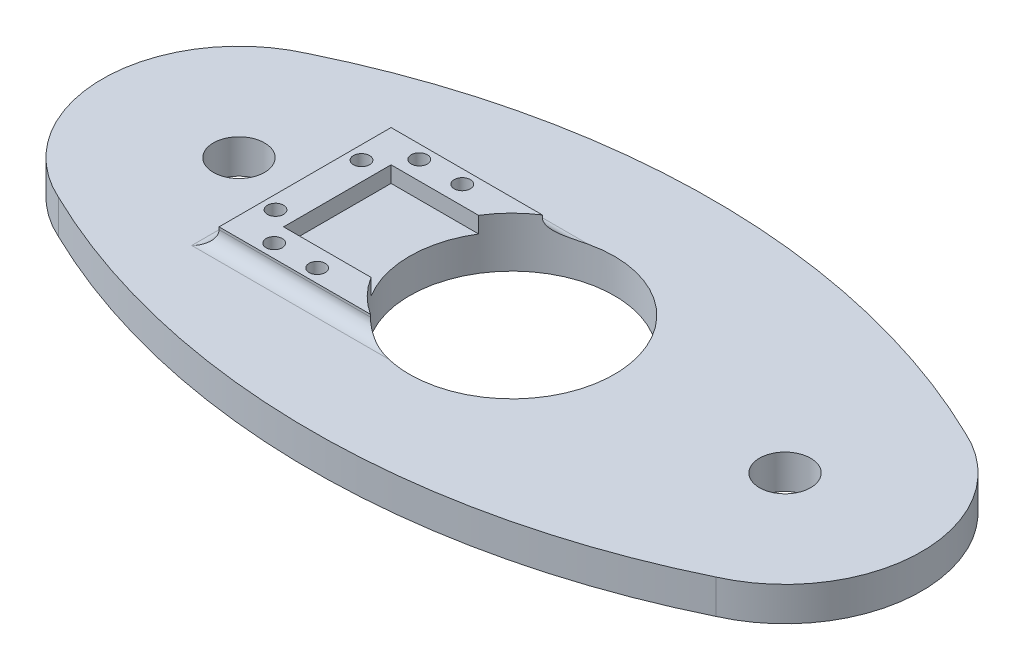
ISO-10303-21;
HEADER;
FILE_DESCRIPTION(('STEP AP214'),'2;1');
FILE_NAME('part.step','',(''),(''),'','','');
FILE_SCHEMA(('AUTOMOTIVE_DESIGN { 1 0 10303 214 1 1 1 1 }'));
ENDSEC;
DATA;
#1=APPLICATION_CONTEXT('core data for automotive mechanical design processes');
#2=APPLICATION_PROTOCOL_DEFINITION('international standard','automotive_design',2000,#1);
#3=PRODUCT_CONTEXT('',#1,'mechanical');
#4=PRODUCT('Part','Part','',(#3));
#5=PRODUCT_RELATED_PRODUCT_CATEGORY('part','',(#4));
#6=PRODUCT_DEFINITION_FORMATION('','',#4);
#7=PRODUCT_DEFINITION_CONTEXT('part definition',#1,'design');
#8=PRODUCT_DEFINITION('design','',#6,#7);
#9=PRODUCT_DEFINITION_SHAPE('','',#8);
#10=(LENGTH_UNIT() NAMED_UNIT(*) SI_UNIT(.MILLI.,.METRE.));
#11=(NAMED_UNIT(*) PLANE_ANGLE_UNIT() SI_UNIT($,.RADIAN.));
#12=(NAMED_UNIT(*) SI_UNIT($,.STERADIAN.) SOLID_ANGLE_UNIT());
#13=UNCERTAINTY_MEASURE_WITH_UNIT(LENGTH_MEASURE(1.E-05),#10,'distance_accuracy_value','');
#14=(GEOMETRIC_REPRESENTATION_CONTEXT(3) GLOBAL_UNCERTAINTY_ASSIGNED_CONTEXT((#13)) GLOBAL_UNIT_ASSIGNED_CONTEXT((#10,
#11,#12)) REPRESENTATION_CONTEXT('',''));
#15=CARTESIAN_POINT('',(0.,0.,0.));
#16=DIRECTION('',(0.,0.,1.));
#17=DIRECTION('',(1.,0.,0.));
#18=AXIS2_PLACEMENT_3D('',#15,#16,#17);
#19=CARTESIAN_POINT('',(-30.75,0.,13.5));
#20=DIRECTION('',(0.,1.,0.));
#21=DIRECTION('',(0.,0.,1.));
#22=AXIS2_PLACEMENT_3D('',#19,#20,#21);
#23=CYLINDRICAL_SURFACE('',#22,1.5);
#24=CARTESIAN_POINT('',(-30.75,9.35,13.5));
#25=DIRECTION('',(0.,1.,0.));
#26=DIRECTION('',(0.,0.,1.));
#27=AXIS2_PLACEMENT_3D('',#24,#25,#26);
#28=CIRCLE('',#27,1.5);
#29=CARTESIAN_POINT('',(-30.75,9.35,15.));
#30=VERTEX_POINT('',#29);
#31=EDGE_CURVE('E279',#30,#30,#28,.T.);
#32=ORIENTED_EDGE('',*,*,#31,.T.);
#33=EDGE_LOOP('',(#32));
#34=FACE_BOUND('',#33,.T.);
#35=CARTESIAN_POINT('',(-30.75,2.85,13.5));
#36=DIRECTION('',(0.,-1.,0.));
#37=DIRECTION('',(0.,0.,-1.));
#38=AXIS2_PLACEMENT_3D('',#35,#36,#37);
#39=CIRCLE('',#38,1.5);
#40=CARTESIAN_POINT('',(-30.75,2.85,12.));
#41=VERTEX_POINT('',#40);
#42=EDGE_CURVE('E138',#41,#41,#39,.F.);
#43=ORIENTED_EDGE('',*,*,#42,.F.);
#44=EDGE_LOOP('',(#43));
#45=FACE_BOUND('',#44,.T.);
#46=ADVANCED_FACE('F133',(#34,#45),#23,.F.);
#47=CARTESIAN_POINT('',(-22.75,0.,-13.5));
#48=DIRECTION('',(0.,1.,0.));
#49=DIRECTION('',(0.,0.,1.));
#50=AXIS2_PLACEMENT_3D('',#47,#48,#49);
#51=CYLINDRICAL_SURFACE('',#50,1.5);
#52=CARTESIAN_POINT('',(-22.75,9.35,-13.5));
#53=DIRECTION('',(0.,1.,0.));
#54=DIRECTION('',(0.,0.,1.));
#55=AXIS2_PLACEMENT_3D('',#52,#53,#54);
#56=CIRCLE('',#55,1.5);
#57=CARTESIAN_POINT('',(-22.75,9.35,-12.));
#58=VERTEX_POINT('',#57);
#59=EDGE_CURVE('E796',#58,#58,#56,.T.);
#60=ORIENTED_EDGE('',*,*,#59,.T.);
#61=EDGE_LOOP('',(#60));
#62=FACE_BOUND('',#61,.T.);
#63=CARTESIAN_POINT('',(-22.75,2.85,-13.5));
#64=DIRECTION('',(0.,-1.,0.));
#65=DIRECTION('',(0.,0.,-1.));
#66=AXIS2_PLACEMENT_3D('',#63,#64,#65);
#67=CIRCLE('',#66,1.5);
#68=CARTESIAN_POINT('',(-22.75,2.85,-15.));
#69=VERTEX_POINT('',#68);
#70=EDGE_CURVE('E833',#69,#69,#67,.F.);
#71=ORIENTED_EDGE('',*,*,#70,.F.);
#72=EDGE_LOOP('',(#71));
#73=FACE_BOUND('',#72,.T.);
#74=ADVANCED_FACE('F390',(#62,#73),#51,.F.);
#75=CARTESIAN_POINT('',(-30.75,0.,-13.5));
#76=DIRECTION('',(0.,1.,0.));
#77=DIRECTION('',(0.,0.,1.));
#78=AXIS2_PLACEMENT_3D('',#75,#76,#77);
#79=CYLINDRICAL_SURFACE('',#78,1.5);
#80=CARTESIAN_POINT('',(-30.75,9.35,-13.5));
#81=DIRECTION('',(0.,1.,0.));
#82=DIRECTION('',(0.,0.,1.));
#83=AXIS2_PLACEMENT_3D('',#80,#81,#82);
#84=CIRCLE('',#83,1.5);
#85=CARTESIAN_POINT('',(-30.75,9.35,-12.));
#86=VERTEX_POINT('',#85);
#87=EDGE_CURVE('E799',#86,#86,#84,.T.);
#88=ORIENTED_EDGE('',*,*,#87,.T.);
#89=EDGE_LOOP('',(#88));
#90=FACE_BOUND('',#89,.T.);
#91=CARTESIAN_POINT('',(-30.75,2.85,-13.5));
#92=DIRECTION('',(0.,-1.,0.));
#93=DIRECTION('',(0.,0.,-1.));
#94=AXIS2_PLACEMENT_3D('',#91,#92,#93);
#95=CIRCLE('',#94,1.5);
#96=CARTESIAN_POINT('',(-30.75,2.85,-15.));
#97=VERTEX_POINT('',#96);
#98=EDGE_CURVE('E843',#97,#97,#95,.F.);
#99=ORIENTED_EDGE('',*,*,#98,.F.);
#100=EDGE_LOOP('',(#99));
#101=FACE_BOUND('',#100,.T.);
#102=ADVANCED_FACE('F396',(#90,#101),#79,.F.);
#103=CARTESIAN_POINT('',(-36.,0.,-7.99999999999999));
#104=DIRECTION('',(0.,1.,0.));
#105=DIRECTION('',(0.,0.,1.));
#106=AXIS2_PLACEMENT_3D('',#103,#104,#105);
#107=CYLINDRICAL_SURFACE('',#106,1.5);
#108=CARTESIAN_POINT('',(-36.,9.35,-7.99999999999999));
#109=DIRECTION('',(0.,1.,0.));
#110=DIRECTION('',(0.,0.,1.));
#111=AXIS2_PLACEMENT_3D('',#108,#109,#110);
#112=CIRCLE('',#111,1.5);
#113=CARTESIAN_POINT('',(-36.,9.35,-6.49999999999999));
#114=VERTEX_POINT('',#113);
#115=EDGE_CURVE('E807',#114,#114,#112,.T.);
#116=ORIENTED_EDGE('',*,*,#115,.T.);
#117=EDGE_LOOP('',(#116));
#118=FACE_BOUND('',#117,.T.);
#119=CARTESIAN_POINT('',(-36.,2.85,-7.99999999999999));
#120=DIRECTION('',(0.,-1.,0.));
#121=DIRECTION('',(0.,0.,-1.));
#122=AXIS2_PLACEMENT_3D('',#119,#120,#121);
#123=CIRCLE('',#122,1.5);
#124=CARTESIAN_POINT('',(-36.,2.85,-9.5));
#125=VERTEX_POINT('',#124);
#126=EDGE_CURVE('E840',#125,#125,#123,.F.);
#127=ORIENTED_EDGE('',*,*,#126,.F.);
#128=EDGE_LOOP('',(#127));
#129=FACE_BOUND('',#128,.T.);
#130=ADVANCED_FACE('F603',(#118,#129),#107,.F.);
#131=CARTESIAN_POINT('',(-36.,0.,8.));
#132=DIRECTION('',(0.,1.,0.));
#133=DIRECTION('',(0.,0.,1.));
#134=AXIS2_PLACEMENT_3D('',#131,#132,#133);
#135=CYLINDRICAL_SURFACE('',#134,1.5);
#136=CARTESIAN_POINT('',(-36.,9.35,8.));
#137=DIRECTION('',(0.,1.,0.));
#138=DIRECTION('',(0.,0.,1.));
#139=AXIS2_PLACEMENT_3D('',#136,#137,#138);
#140=CIRCLE('',#139,1.5);
#141=CARTESIAN_POINT('',(-36.,9.35,9.50000000000001));
#142=VERTEX_POINT('',#141);
#143=EDGE_CURVE('E804',#142,#142,#140,.T.);
#144=ORIENTED_EDGE('',*,*,#143,.T.);
#145=EDGE_LOOP('',(#144));
#146=FACE_BOUND('',#145,.T.);
#147=CARTESIAN_POINT('',(-36.,2.85,8.));
#148=DIRECTION('',(0.,-1.,0.));
#149=DIRECTION('',(0.,0.,-1.));
#150=AXIS2_PLACEMENT_3D('',#147,#148,#149);
#151=CIRCLE('',#150,1.5);
#152=CARTESIAN_POINT('',(-36.,2.85,6.5));
#153=VERTEX_POINT('',#152);
#154=EDGE_CURVE('E837',#153,#153,#151,.F.);
#155=ORIENTED_EDGE('',*,*,#154,.F.);
#156=EDGE_LOOP('',(#155));
#157=FACE_BOUND('',#156,.T.);
#158=ADVANCED_FACE('F612',(#146,#157),#135,.F.);
#159=CARTESIAN_POINT('',(-22.75,0.,13.5));
#160=DIRECTION('',(0.,1.,0.));
#161=DIRECTION('',(0.,0.,1.));
#162=AXIS2_PLACEMENT_3D('',#159,#160,#161);
#163=CYLINDRICAL_SURFACE('',#162,1.5);
#164=CARTESIAN_POINT('',(-22.75,9.35,13.5));
#165=DIRECTION('',(0.,1.,0.));
#166=DIRECTION('',(0.,0.,1.));
#167=AXIS2_PLACEMENT_3D('',#164,#165,#166);
#168=CIRCLE('',#167,1.5);
#169=CARTESIAN_POINT('',(-22.75,9.35,15.));
#170=VERTEX_POINT('',#169);
#171=EDGE_CURVE('E801',#170,#170,#168,.T.);
#172=ORIENTED_EDGE('',*,*,#171,.T.);
#173=EDGE_LOOP('',(#172));
#174=FACE_BOUND('',#173,.T.);
#175=CARTESIAN_POINT('',(-22.75,2.85,13.5));
#176=DIRECTION('',(0.,-1.,0.));
#177=DIRECTION('',(0.,0.,-1.));
#178=AXIS2_PLACEMENT_3D('',#175,#176,#177);
#179=CIRCLE('',#178,1.5);
#180=CARTESIAN_POINT('',(-22.75,2.85,12.));
#181=VERTEX_POINT('',#180);
#182=EDGE_CURVE('E793',#181,#181,#179,.F.);
#183=ORIENTED_EDGE('',*,*,#182,.F.);
#184=EDGE_LOOP('',(#183));
#185=FACE_BOUND('',#184,.T.);
#186=ADVANCED_FACE('F450',(#174,#185),#163,.F.);
#187=CARTESIAN_POINT('',(0.,6.35,0.));
#188=DIRECTION('',(0.,1.,0.));
#189=DIRECTION('',(0.,0.,1.));
#190=AXIS2_PLACEMENT_3D('',#187,#188,#189);
#191=PLANE('',#190);
#192=DIRECTION('',(0.,0.,1.));
#193=VECTOR('',#192,1.);
#194=CARTESIAN_POINT('',(-32.5,6.35,0.));
#195=LINE('',#194,#193);
#196=CARTESIAN_POINT('',(-32.5,6.35,-10.));
#197=VERTEX_POINT('',#196);
#198=CARTESIAN_POINT('',(-32.5,6.35,10.));
#199=VERTEX_POINT('',#198);
#200=EDGE_CURVE('E247',#197,#199,#195,.T.);
#201=ORIENTED_EDGE('',*,*,#200,.T.);
#202=DIRECTION('',(1.,0.,0.));
#203=VECTOR('',#202,1.);
#204=CARTESIAN_POINT('',(0.,6.35,10.));
#205=LINE('',#204,#203);
#206=CARTESIAN_POINT('',(-16.2142684077944,6.35,10.));
#207=VERTEX_POINT('',#206);
#208=EDGE_CURVE('E265',#199,#207,#205,.T.);
#209=ORIENTED_EDGE('',*,*,#208,.T.);
#210=CARTESIAN_POINT('',(0.,6.35,0.));
#211=DIRECTION('',(0.,1.,0.));
#212=DIRECTION('',(0.,0.,1.));
#213=AXIS2_PLACEMENT_3D('',#210,#211,#212);
#214=CIRCLE('',#213,19.05);
#215=CARTESIAN_POINT('',(-16.2142684077944,6.35,-10.));
#216=VERTEX_POINT('',#215);
#217=EDGE_CURVE('E253',#216,#207,#214,.T.);
#218=ORIENTED_EDGE('',*,*,#217,.F.);
#219=DIRECTION('',(-1.,0.,0.));
#220=VECTOR('',#219,1.);
#221=CARTESIAN_POINT('',(0.,6.35,-10.));
#222=LINE('',#221,#220);
#223=EDGE_CURVE('E262',#216,#197,#222,.T.);
#224=ORIENTED_EDGE('',*,*,#223,.T.);
#225=EDGE_LOOP('',(#201,#209,#218,#224));
#226=FACE_BOUND('',#225,.T.);
#227=ADVANCED_FACE('F442',(#226),#191,.T.);
#228=DIRECTION('',(0.,0.,1.));
#229=VECTOR('',#228,1.);
#230=CARTESIAN_POINT('',(-41.04,6.35,0.));
#231=LINE('',#230,#229);
#232=CARTESIAN_POINT('',(-41.04,6.35,18.54));
#233=VERTEX_POINT('',#232);
#234=CARTESIAN_POINT('',(-41.04,6.35,-18.54));
#235=VERTEX_POINT('',#234);
#236=EDGE_CURVE('E349',#233,#235,#231,.F.);
#237=ORIENTED_EDGE('',*,*,#236,.T.);
#238=DIRECTION('',(1.,0.,0.));
#239=VECTOR('',#238,1.);
#240=CARTESIAN_POINT('',(-10.3393665183124,6.35,-18.54));
#241=LINE('',#240,#239);
#242=CARTESIAN_POINT('',(-4.3784586328981,6.35,-18.54));
#243=VERTEX_POINT('',#242);
#244=EDGE_CURVE('E351',#235,#243,#241,.T.);
#245=ORIENTED_EDGE('',*,*,#244,.T.);
#246=CARTESIAN_POINT('',(-4.37845863289817,6.35,18.54));
#247=VERTEX_POINT('',#246);
#248=EDGE_CURVE('E297',#247,#243,#214,.T.);
#249=ORIENTED_EDGE('',*,*,#248,.F.);
#250=DIRECTION('',(1.,0.,0.));
#251=VECTOR('',#250,1.);
#252=CARTESIAN_POINT('',(0.,6.35,18.54));
#253=LINE('',#252,#251);
#254=EDGE_CURVE('E346',#247,#233,#253,.F.);
#255=ORIENTED_EDGE('',*,*,#254,.T.);
#256=EDGE_LOOP('',(#237,#245,#249,#255));
#257=FACE_BOUND('',#256,.T.);
#258=CARTESIAN_POINT('',(0.,6.35,-102.409936312052));
#259=DIRECTION('',(0.,1.,0.));
#260=DIRECTION('',(0.,0.,1.));
#261=AXIS2_PLACEMENT_3D('',#258,#259,#260);
#262=CIRCLE('',#261,139.7);
#263=CARTESIAN_POINT('',(-61.1507706135107,6.35,23.1952914986314));
#264=VERTEX_POINT('',#263);
#265=CARTESIAN_POINT('',(61.1507706135112,6.35,23.1952914986312));
#266=VERTEX_POINT('',#265);
#267=EDGE_CURVE('E313',#264,#266,#262,.T.);
#268=ORIENTED_EDGE('',*,*,#267,.T.);
#269=CARTESIAN_POINT('',(50.8,6.35,0.));
#270=DIRECTION('',(0.,1.,0.));
#271=DIRECTION('',(0.,0.,1.));
#272=AXIS2_PLACEMENT_3D('',#269,#270,#271);
#273=CIRCLE('',#272,25.4);
#274=CARTESIAN_POINT('',(61.1507706135103,6.35,-23.1952914986316));
#275=VERTEX_POINT('',#274);
#276=EDGE_CURVE('E331',#266,#275,#273,.T.);
#277=ORIENTED_EDGE('',*,*,#276,.T.);
#278=CARTESIAN_POINT('',(0.,6.35,102.409936312052));
#279=DIRECTION('',(0.,1.,0.));
#280=DIRECTION('',(0.,0.,1.));
#281=AXIS2_PLACEMENT_3D('',#278,#279,#280);
#282=CIRCLE('',#281,139.7);
#283=CARTESIAN_POINT('',(-61.1507706135103,6.35,-23.1952914986316));
#284=VERTEX_POINT('',#283);
#285=EDGE_CURVE('E339',#284,#275,#282,.F.);
#286=ORIENTED_EDGE('',*,*,#285,.F.);
#287=CARTESIAN_POINT('',(-50.8,6.35,0.));
#288=DIRECTION('',(0.,1.,0.));
#289=DIRECTION('',(0.,0.,1.));
#290=AXIS2_PLACEMENT_3D('',#287,#288,#289);
#291=CIRCLE('',#290,25.4);
#292=EDGE_CURVE('E325',#284,#264,#291,.T.);
#293=ORIENTED_EDGE('',*,*,#292,.T.);
#294=EDGE_LOOP('',(#268,#277,#286,#293));
#295=FACE_BOUND('',#294,.T.);
#296=CARTESIAN_POINT('',(-50.8,6.35,0.));
#297=DIRECTION('',(0.,1.,0.));
#298=DIRECTION('',(0.,0.,1.));
#299=AXIS2_PLACEMENT_3D('',#296,#297,#298);
#300=CIRCLE('',#299,4.7625);
#301=CARTESIAN_POINT('',(-50.8,6.35,4.7625));
#302=VERTEX_POINT('',#301);
#303=EDGE_CURVE('E301',#302,#302,#300,.T.);
#304=ORIENTED_EDGE('',*,*,#303,.F.);
#305=EDGE_LOOP('',(#304));
#306=FACE_BOUND('',#305,.T.);
#307=CARTESIAN_POINT('',(50.8,6.35,0.));
#308=DIRECTION('',(0.,1.,0.));
#309=DIRECTION('',(0.,0.,1.));
#310=AXIS2_PLACEMENT_3D('',#307,#308,#309);
#311=CIRCLE('',#310,4.7625);
#312=CARTESIAN_POINT('',(50.8,6.35,4.7625));
#313=VERTEX_POINT('',#312);
#314=EDGE_CURVE('E302',#313,#313,#311,.F.);
#315=ORIENTED_EDGE('',*,*,#314,.T.);
#316=EDGE_LOOP('',(#315));
#317=FACE_BOUND('',#316,.T.);
#318=ADVANCED_FACE('F440',(#257,#295,#306,#317),#191,.T.);
#319=CARTESIAN_POINT('',(0.,0.,0.));
#320=DIRECTION('',(0.,1.,0.));
#321=DIRECTION('',(0.,0.,1.));
#322=AXIS2_PLACEMENT_3D('',#319,#320,#321);
#323=PLANE('',#322);
#324=CARTESIAN_POINT('',(-22.75,0.,-13.5));
#325=DIRECTION('',(0.,-1.,0.));
#326=DIRECTION('',(0.,0.,-1.));
#327=AXIS2_PLACEMENT_3D('',#324,#325,#326);
#328=CIRCLE('',#327,2.5);
#329=CARTESIAN_POINT('',(-22.75,0.,-16.));
#330=VERTEX_POINT('',#329);
#331=EDGE_CURVE('E787',#330,#330,#328,.T.);
#332=ORIENTED_EDGE('',*,*,#331,.F.);
#333=EDGE_LOOP('',(#332));
#334=FACE_BOUND('',#333,.T.);
#335=CARTESIAN_POINT('',(-30.75,0.,-13.5));
#336=DIRECTION('',(0.,-1.,0.));
#337=DIRECTION('',(0.,0.,-1.));
#338=AXIS2_PLACEMENT_3D('',#335,#336,#337);
#339=CIRCLE('',#338,2.5);
#340=CARTESIAN_POINT('',(-30.75,0.,-16.));
#341=VERTEX_POINT('',#340);
#342=EDGE_CURVE('E781',#341,#341,#339,.T.);
#343=ORIENTED_EDGE('',*,*,#342,.F.);
#344=EDGE_LOOP('',(#343));
#345=FACE_BOUND('',#344,.T.);
#346=CARTESIAN_POINT('',(-36.,0.,-7.99999999999999));
#347=DIRECTION('',(0.,-1.,0.));
#348=DIRECTION('',(0.,0.,-1.));
#349=AXIS2_PLACEMENT_3D('',#346,#347,#348);
#350=CIRCLE('',#349,2.5);
#351=CARTESIAN_POINT('',(-36.,0.,-10.5));
#352=VERTEX_POINT('',#351);
#353=EDGE_CURVE('E775',#352,#352,#350,.T.);
#354=ORIENTED_EDGE('',*,*,#353,.F.);
#355=EDGE_LOOP('',(#354));
#356=FACE_BOUND('',#355,.T.);
#357=CARTESIAN_POINT('',(-36.,0.,8.));
#358=DIRECTION('',(0.,-1.,0.));
#359=DIRECTION('',(0.,0.,-1.));
#360=AXIS2_PLACEMENT_3D('',#357,#358,#359);
#361=CIRCLE('',#360,2.5);
#362=CARTESIAN_POINT('',(-36.,0.,5.5));
#363=VERTEX_POINT('',#362);
#364=EDGE_CURVE('E767',#363,#363,#361,.T.);
#365=ORIENTED_EDGE('',*,*,#364,.F.);
#366=EDGE_LOOP('',(#365));
#367=FACE_BOUND('',#366,.T.);
#368=CARTESIAN_POINT('',(-30.75,0.,13.5));
#369=DIRECTION('',(0.,-1.,0.));
#370=DIRECTION('',(0.,0.,-1.));
#371=AXIS2_PLACEMENT_3D('',#368,#369,#370);
#372=CIRCLE('',#371,2.5);
#373=CARTESIAN_POINT('',(-30.75,0.,11.));
#374=VERTEX_POINT('',#373);
#375=EDGE_CURVE('E760',#374,#374,#372,.T.);
#376=ORIENTED_EDGE('',*,*,#375,.F.);
#377=EDGE_LOOP('',(#376));
#378=FACE_BOUND('',#377,.T.);
#379=CARTESIAN_POINT('',(-22.75,0.,13.5));
#380=DIRECTION('',(0.,-1.,0.));
#381=DIRECTION('',(0.,0.,-1.));
#382=AXIS2_PLACEMENT_3D('',#379,#380,#381);
#383=CIRCLE('',#382,2.5);
#384=CARTESIAN_POINT('',(-22.75,0.,11.));
#385=VERTEX_POINT('',#384);
#386=EDGE_CURVE('E764',#385,#385,#383,.T.);
#387=ORIENTED_EDGE('',*,*,#386,.F.);
#388=EDGE_LOOP('',(#387));
#389=FACE_BOUND('',#388,.T.);
#390=CARTESIAN_POINT('',(0.,0.,0.));
#391=DIRECTION('',(0.,1.,0.));
#392=DIRECTION('',(0.,0.,1.));
#393=AXIS2_PLACEMENT_3D('',#390,#391,#392);
#394=CIRCLE('',#393,19.05);
#395=CARTESIAN_POINT('',(0.,0.,19.05));
#396=VERTEX_POINT('',#395);
#397=EDGE_CURVE('E305',#396,#396,#394,.T.);
#398=ORIENTED_EDGE('',*,*,#397,.T.);
#399=EDGE_LOOP('',(#398));
#400=FACE_BOUND('',#399,.T.);
#401=CARTESIAN_POINT('',(-50.8,0.,0.));
#402=DIRECTION('',(0.,1.,0.));
#403=DIRECTION('',(0.,0.,1.));
#404=AXIS2_PLACEMENT_3D('',#401,#402,#403);
#405=CIRCLE('',#404,4.7625);
#406=CARTESIAN_POINT('',(-50.8,0.,4.7625));
#407=VERTEX_POINT('',#406);
#408=EDGE_CURVE('E310',#407,#407,#405,.T.);
#409=ORIENTED_EDGE('',*,*,#408,.T.);
#410=EDGE_LOOP('',(#409));
#411=FACE_BOUND('',#410,.T.);
#412=CARTESIAN_POINT('',(50.8,0.,0.));
#413=DIRECTION('',(0.,1.,0.));
#414=DIRECTION('',(0.,0.,1.));
#415=AXIS2_PLACEMENT_3D('',#412,#413,#414);
#416=CIRCLE('',#415,25.4);
#417=CARTESIAN_POINT('',(61.1507706135112,0.,23.1952914986312));
#418=VERTEX_POINT('',#417);
#419=CARTESIAN_POINT('',(61.1507706135103,0.,-23.1952914986316));
#420=VERTEX_POINT('',#419);
#421=EDGE_CURVE('E334',#418,#420,#416,.T.);
#422=ORIENTED_EDGE('',*,*,#421,.F.);
#423=CARTESIAN_POINT('',(0.,0.,-102.409936312052));
#424=DIRECTION('',(0.,1.,0.));
#425=DIRECTION('',(0.,0.,1.));
#426=AXIS2_PLACEMENT_3D('',#423,#424,#425);
#427=CIRCLE('',#426,139.7);
#428=CARTESIAN_POINT('',(-61.1507706135107,0.,23.1952914986314));
#429=VERTEX_POINT('',#428);
#430=EDGE_CURVE('E316',#429,#418,#427,.T.);
#431=ORIENTED_EDGE('',*,*,#430,.F.);
#432=CARTESIAN_POINT('',(-50.8,0.,0.));
#433=DIRECTION('',(0.,1.,0.));
#434=DIRECTION('',(0.,0.,1.));
#435=AXIS2_PLACEMENT_3D('',#432,#433,#434);
#436=CIRCLE('',#435,25.4);
#437=CARTESIAN_POINT('',(-61.1507706135103,0.,-23.1952914986316));
#438=VERTEX_POINT('',#437);
#439=EDGE_CURVE('E328',#438,#429,#436,.T.);
#440=ORIENTED_EDGE('',*,*,#439,.F.);
#441=CARTESIAN_POINT('',(0.,0.,102.409936312052));
#442=DIRECTION('',(0.,1.,0.));
#443=DIRECTION('',(0.,0.,1.));
#444=AXIS2_PLACEMENT_3D('',#441,#442,#443);
#445=CIRCLE('',#444,139.7);
#446=EDGE_CURVE('E330',#438,#420,#445,.F.);
#447=ORIENTED_EDGE('',*,*,#446,.T.);
#448=EDGE_LOOP('',(#422,#431,#440,#447));
#449=FACE_BOUND('',#448,.T.);
#450=CARTESIAN_POINT('',(50.8,0.,0.));
#451=DIRECTION('',(0.,1.,0.));
#452=DIRECTION('',(0.,0.,1.));
#453=AXIS2_PLACEMENT_3D('',#450,#451,#452);
#454=CIRCLE('',#453,4.7625);
#455=CARTESIAN_POINT('',(50.8,0.,4.7625));
#456=VERTEX_POINT('',#455);
#457=EDGE_CURVE('E298',#456,#456,#454,.F.);
#458=ORIENTED_EDGE('',*,*,#457,.F.);
#459=EDGE_LOOP('',(#458));
#460=FACE_BOUND('',#459,.T.);
#461=ADVANCED_FACE('F379',(#334,#345,#356,#367,#378,#389,#400,#411,#449,#460),#323,.F.);
#462=CARTESIAN_POINT('',(-50.8,0.,0.));
#463=DIRECTION('',(0.,1.,0.));
#464=DIRECTION('',(0.,0.,1.));
#465=AXIS2_PLACEMENT_3D('',#462,#463,#464);
#466=CYLINDRICAL_SURFACE('',#465,25.4);
#467=ORIENTED_EDGE('',*,*,#292,.F.);
#468=DIRECTION('',(0.,1.,0.));
#469=VECTOR('',#468,1.);
#470=CARTESIAN_POINT('',(-61.1507706135103,0.,-23.1952914986316));
#471=LINE('',#470,#469);
#472=EDGE_CURVE('E337',#438,#284,#471,.T.);
#473=ORIENTED_EDGE('',*,*,#472,.F.);
#474=ORIENTED_EDGE('',*,*,#439,.T.);
#475=DIRECTION('',(0.,1.,0.));
#476=VECTOR('',#475,1.);
#477=CARTESIAN_POINT('',(-61.1507706135107,0.,23.1952914986314));
#478=LINE('',#477,#476);
#479=EDGE_CURVE('E319',#429,#264,#478,.T.);
#480=ORIENTED_EDGE('',*,*,#479,.T.);
#481=EDGE_LOOP('',(#467,#473,#474,#480));
#482=FACE_BOUND('',#481,.T.);
#483=ADVANCED_FACE('F448',(#482),#466,.T.);
#484=CARTESIAN_POINT('',(50.8,0.,0.));
#485=DIRECTION('',(0.,1.,0.));
#486=DIRECTION('',(0.,0.,1.));
#487=AXIS2_PLACEMENT_3D('',#484,#485,#486);
#488=CYLINDRICAL_SURFACE('',#487,25.4);
#489=ORIENTED_EDGE('',*,*,#276,.F.);
#490=DIRECTION('',(0.,1.,0.));
#491=VECTOR('',#490,1.);
#492=CARTESIAN_POINT('',(61.1507706135112,0.,23.1952914986312));
#493=LINE('',#492,#491);
#494=EDGE_CURVE('E322',#418,#266,#493,.T.);
#495=ORIENTED_EDGE('',*,*,#494,.F.);
#496=ORIENTED_EDGE('',*,*,#421,.T.);
#497=DIRECTION('',(0.,1.,0.));
#498=VECTOR('',#497,1.);
#499=CARTESIAN_POINT('',(61.1507706135103,0.,-23.1952914986316));
#500=LINE('',#499,#498);
#501=EDGE_CURVE('E344',#420,#275,#500,.T.);
#502=ORIENTED_EDGE('',*,*,#501,.T.);
#503=EDGE_LOOP('',(#489,#495,#496,#502));
#504=FACE_BOUND('',#503,.T.);
#505=ADVANCED_FACE('F456',(#504),#488,.T.);
#506=CARTESIAN_POINT('',(0.,0.,102.409936312052));
#507=DIRECTION('',(0.,1.,0.));
#508=DIRECTION('',(0.,0.,1.));
#509=AXIS2_PLACEMENT_3D('',#506,#507,#508);
#510=CYLINDRICAL_SURFACE('',#509,139.7);
#511=ORIENTED_EDGE('',*,*,#285,.T.);
#512=ORIENTED_EDGE('',*,*,#501,.F.);
#513=ORIENTED_EDGE('',*,*,#446,.F.);
#514=ORIENTED_EDGE('',*,*,#472,.T.);
#515=EDGE_LOOP('',(#511,#512,#513,#514));
#516=FACE_BOUND('',#515,.T.);
#517=ADVANCED_FACE('F458',(#516),#510,.T.);
#518=CARTESIAN_POINT('',(0.,0.,-102.409936312052));
#519=DIRECTION('',(0.,1.,0.));
#520=DIRECTION('',(0.,0.,1.));
#521=AXIS2_PLACEMENT_3D('',#518,#519,#520);
#522=CYLINDRICAL_SURFACE('',#521,139.7);
#523=ORIENTED_EDGE('',*,*,#267,.F.);
#524=ORIENTED_EDGE('',*,*,#479,.F.);
#525=ORIENTED_EDGE('',*,*,#430,.T.);
#526=ORIENTED_EDGE('',*,*,#494,.T.);
#527=EDGE_LOOP('',(#523,#524,#525,#526));
#528=FACE_BOUND('',#527,.T.);
#529=ADVANCED_FACE('F434',(#528),#522,.T.);
#530=CARTESIAN_POINT('',(-50.8,0.,0.));
#531=DIRECTION('',(0.,1.,0.));
#532=DIRECTION('',(0.,0.,1.));
#533=AXIS2_PLACEMENT_3D('',#530,#531,#532);
#534=CYLINDRICAL_SURFACE('',#533,4.7625);
#535=ORIENTED_EDGE('',*,*,#408,.F.);
#536=EDGE_LOOP('',(#535));
#537=FACE_BOUND('',#536,.T.);
#538=ORIENTED_EDGE('',*,*,#303,.T.);
#539=EDGE_LOOP('',(#538));
#540=FACE_BOUND('',#539,.T.);
#541=ADVANCED_FACE('F427',(#537,#540),#534,.F.);
#542=CARTESIAN_POINT('',(50.8,0.,0.));
#543=DIRECTION('',(0.,1.,0.));
#544=DIRECTION('',(0.,0.,1.));
#545=AXIS2_PLACEMENT_3D('',#542,#543,#544);
#546=CYLINDRICAL_SURFACE('',#545,4.7625);
#547=ORIENTED_EDGE('',*,*,#457,.T.);
#548=EDGE_LOOP('',(#547));
#549=FACE_BOUND('',#548,.T.);
#550=ORIENTED_EDGE('',*,*,#314,.F.);
#551=EDGE_LOOP('',(#550));
#552=FACE_BOUND('',#551,.T.);
#553=ADVANCED_FACE('F425',(#549,#552),#546,.F.);
#554=CARTESIAN_POINT('',(0.,0.,0.));
#555=DIRECTION('',(0.,1.,0.));
#556=DIRECTION('',(0.,0.,1.));
#557=AXIS2_PLACEMENT_3D('',#554,#555,#556);
#558=CYLINDRICAL_SURFACE('',#557,19.05);
#559=ORIENTED_EDGE('',*,*,#397,.F.);
#560=EDGE_LOOP('',(#559));
#561=FACE_BOUND('',#560,.T.);
#562=DIRECTION('',(0.,-1.,0.));
#563=VECTOR('',#562,1.);
#564=CARTESIAN_POINT('',(-10.3393665183124,51.9765325600141,16.));
#565=LINE('',#564,#563);
#566=CARTESIAN_POINT('',(-10.3393665183124,9.35,16.));
#567=VERTEX_POINT('',#566);
#568=CARTESIAN_POINT('',(-10.3393665183124,8.89,16.));
#569=VERTEX_POINT('',#568);
#570=EDGE_CURVE('E257',#567,#569,#565,.T.);
#571=ORIENTED_EDGE('',*,*,#570,.T.);
#572=CARTESIAN_POINT('',(-10.3393665183124,8.89,16.));
#573=CARTESIAN_POINT('',(-10.3393871453874,8.84141264323827,15.9999842031526));
#574=CARTESIAN_POINT('',(-10.3372099674365,8.79284075558111,16.0013935449986));
#575=CARTESIAN_POINT('',(-10.328620749069,8.69629276025455,16.0069403826135));
#576=CARTESIAN_POINT('',(-10.3222143221336,8.64831594861963,16.0110742620924));
#577=CARTESIAN_POINT('',(-10.3054336593053,8.553993458912,16.0218796906637));
#578=CARTESIAN_POINT('',(-10.29511077074,8.50763481134392,16.0285183939511));
#579=CARTESIAN_POINT('',(-10.2707641508392,8.41630909376887,16.0441302139092));
#580=CARTESIAN_POINT('',(-10.2567394852268,8.3713423782717,16.0531039198937));
#581=CARTESIAN_POINT('',(-10.2097330779907,8.23947453212815,16.0830725196289));
#582=CARTESIAN_POINT('',(-10.1717105373866,8.15502921600714,16.1071855662611));
#583=CARTESIAN_POINT('',(-10.0847929610612,7.99400819244444,16.1617478846701));
#584=CARTESIAN_POINT('',(-10.0358609163765,7.91746060156446,16.1922187011678));
#585=CARTESIAN_POINT('',(-9.90170442885738,7.73459463131062,16.2747568039531));
#586=CARTESIAN_POINT('',(-9.81090490845876,7.63371660121513,16.3297695523029));
#587=CARTESIAN_POINT('',(-9.6161659695762,7.44940540931273,16.445204397167));
#588=CARTESIAN_POINT('',(-9.51219992494278,7.3660085326635,16.5056373804572));
#589=CARTESIAN_POINT('',(-9.30981712117991,7.22437313757453,16.6205145654518));
#590=CARTESIAN_POINT('',(-9.21252447456925,7.16426076003962,16.6746757163849));
#591=CARTESIAN_POINT('',(-9.01281218835231,7.05364336231739,16.7834638544345));
#592=CARTESIAN_POINT('',(-8.91038866199368,7.00314576891218,16.8380911678756));
#593=CARTESIAN_POINT('',(-8.7014984680603,6.9103464002824,16.946985889762));
#594=CARTESIAN_POINT('',(-8.59502520305645,6.868058749398,17.0012525255268));
#595=CARTESIAN_POINT('',(-8.37899053843884,6.7905870987535,17.1087575831628));
#596=CARTESIAN_POINT('',(-8.26942795145867,6.75540587392212,17.1619955960657));
#597=CARTESIAN_POINT('',(-8.04502731880388,6.69034409390022,17.2683479830801));
#598=CARTESIAN_POINT('',(-7.93012599108187,6.66062156138513,17.3214245947833));
#599=CARTESIAN_POINT('',(-7.69820118760472,6.60669906929094,17.4257391686629));
#600=CARTESIAN_POINT('',(-7.58117725652923,6.58250031011032,17.4769767291511));
#601=CARTESIAN_POINT('',(-7.22729180606578,6.51696555022443,17.6276615568006));
#602=CARTESIAN_POINT('',(-6.9877777551489,6.48273515304379,17.7240044221823));
#603=CARTESIAN_POINT('',(-6.50343473631719,6.42818083570297,17.9074028736554));
#604=CARTESIAN_POINT('',(-6.25859917179001,6.40787532650821,17.9944460362336));
#605=CARTESIAN_POINT('',(-5.76514549761295,6.37741997885387,18.1585561095474));
#606=CARTESIAN_POINT('',(-5.51652936236471,6.36726501248949,18.2356280404525));
#607=CARTESIAN_POINT('',(-5.11912329279261,6.35676445695652,18.3499474466162));
#608=CARTESIAN_POINT('',(-4.97133505855229,6.35410212978933,18.3905360996557));
#609=CARTESIAN_POINT('',(-4.67532323078072,6.35072736766284,18.4680040796742));
#610=CARTESIAN_POINT('',(-4.52710301021974,6.35000808984283,18.5048959822469));
#611=CARTESIAN_POINT('',(-4.37845863289817,6.35,18.54));
#612=B_SPLINE_CURVE_WITH_KNOTS('',3,(#572,#573,#574,#575,#576,#577,#578,#579,#580,#581,#582,
#583,#584,#585,#586,#587,#588,#589,#590,#591,#592,#593,#594,#595,#596,#597,#598,#599,#600,#601,
#602,#603,#604,#605,#606,#607,#608,#609,#610,#611),.UNSPECIFIED.,.F.,.F.,(4,2,2,2,2,2,2,2,2,2,2,
2,2,2,2,2,2,2,2,4),(0.,0.145668006133393,0.291143054847159,0.434773287304365,0.578439804748061,
0.864027487840434,1.15059914082151,1.58745985196408,2.02521855508071,2.40429989007112,
2.7836728627378,3.16369283281464,3.54386090805923,3.93372214439536,4.32366802291558,
5.10410911533344,5.88558009852865,6.66665609425827,7.12645763287319,7.58463775872894),.UNSPECIFIED.);
#613=EDGE_CURVE('E12',#569,#247,#612,.T.);
#614=ORIENTED_EDGE('',*,*,#613,.T.);
#615=ORIENTED_EDGE('',*,*,#248,.T.);
#616=CARTESIAN_POINT('',(-4.3784586328981,6.35,-18.54));
#617=CARTESIAN_POINT('',(-4.51792632811211,6.35000733337387,-18.5070634682694));
#618=CARTESIAN_POINT('',(-4.65702553305135,6.35064095058742,-18.4725513048527));
#619=CARTESIAN_POINT('',(-4.93441322653842,6.3535803388061,-18.400396807826));
#620=CARTESIAN_POINT('',(-5.07270159120438,6.35588635894217,-18.3627540085979));
#621=CARTESIAN_POINT('',(-5.34879812391607,6.3626012308786,-18.284242374114));
#622=CARTESIAN_POINT('',(-5.48660329123363,6.36701686131761,-18.243363496413));
#623=CARTESIAN_POINT('',(-5.76113985777414,6.37844448381238,-18.1585358228876));
#624=CARTESIAN_POINT('',(-5.89787130982248,6.38545634730919,-18.1145871791576));
#625=CARTESIAN_POINT('',(-6.30648956512509,6.41118459141698,-17.9781285609309));
#626=CARTESIAN_POINT('',(-6.57663479902076,6.4345908442483,-17.881052967412));
#627=CARTESIAN_POINT('',(-6.97675801631933,6.48301958581797,-17.7270353035775));
#628=CARTESIAN_POINT('',(-7.1092035826755,6.50136705431061,-17.6743302926537));
#629=CARTESIAN_POINT('',(-7.37215711674629,6.54333744266353,-17.5662740197199));
#630=CARTESIAN_POINT('',(-7.50266547200736,6.56695929177127,-17.5109232966061));
#631=CARTESIAN_POINT('',(-7.71899014445659,6.61167972160541,-17.416334469531));
#632=CARTESIAN_POINT('',(-7.80544737932613,6.63107175227075,-17.3777551508912));
#633=CARTESIAN_POINT('',(-7.97713801999214,6.67301832487901,-17.2996149644235));
#634=CARTESIAN_POINT('',(-8.0623713820865,6.69557297944502,-17.2600540616821));
#635=CARTESIAN_POINT('',(-8.31649145737875,6.76868803245692,-17.1398238273725));
#636=CARTESIAN_POINT('',(-8.48330372964307,6.82460192508815,-17.0578235399012));
#637=CARTESIAN_POINT('',(-8.74725950834457,6.92979341235681,-16.9233831147595));
#638=CARTESIAN_POINT('',(-8.84688351549221,6.97357802895907,-16.8714969660388));
#639=CARTESIAN_POINT('',(-9.0422465513976,7.06922986858326,-16.7676026864511));
#640=CARTESIAN_POINT('',(-9.137983515719,7.12110131759502,-16.7155945058892));
#641=CARTESIAN_POINT('',(-9.32382340603108,7.23388645686024,-16.6126470542228));
#642=CARTESIAN_POINT('',(-9.41395275736138,7.29475230839488,-16.5617036634516));
#643=CARTESIAN_POINT('',(-9.58728753079244,7.42704598588281,-16.4619676588913));
#644=CARTESIAN_POINT('',(-9.67050325171796,7.49845764498848,-16.4131718988173));
#645=CARTESIAN_POINT('',(-9.8151045452265,7.64093156886167,-16.3270372608418));
#646=CARTESIAN_POINT('',(-9.87785575069045,7.71023642149641,-16.2891117298702));
#647=CARTESIAN_POINT('',(-9.99475122115165,7.85800354862994,-16.2176489844671));
#648=CARTESIAN_POINT('',(-10.0488911413551,7.93647041138526,-16.1841139867634));
#649=CARTESIAN_POINT('',(-10.1463985111662,8.10354818100686,-16.1231650150727));
#650=CARTESIAN_POINT('',(-10.1896296212531,8.19226901976066,-16.0958289057394));
#651=CARTESIAN_POINT('',(-10.2610509023553,8.37767024312616,-16.0503942920811));
#652=CARTESIAN_POINT('',(-10.2892923667193,8.47432215975275,-16.0322642945361));
#653=CARTESIAN_POINT('',(-10.3187585683206,8.62515130275655,-16.0133026887491));
#654=CARTESIAN_POINT('',(-10.3264445019485,8.67761566503965,-16.0083448522033));
#655=CARTESIAN_POINT('',(-10.3367641202,8.78336893314595,-16.0016818476398));
#656=CARTESIAN_POINT('',(-10.3393855102146,8.83665952970715,-15.9999845950222));
#657=CARTESIAN_POINT('',(-10.3393665183124,8.89,-16.));
#658=B_SPLINE_CURVE_WITH_KNOTS('',3,(#616,#617,#618,#619,#620,#621,#622,#623,#624,#625,#626,
#627,#628,#629,#630,#631,#632,#633,#634,#635,#636,#637,#638,#639,#640,#641,#642,#643,#644,#645,
#646,#647,#648,#649,#650,#651,#652,#653,#654,#655,#656,#657),.UNSPECIFIED.,.F.,.F.,(4,2,2,2,2,2,
2,2,2,2,2,2,2,2,2,2,2,2,2,2,4),(0.,0.429906301335572,0.859876657191173,1.2912379900551,
1.72257796584068,2.58577335541162,3.0168422041925,3.4478236210799,3.73768094212869,
4.02754858780652,4.60892563876822,4.97034163096969,5.33194712775282,5.69169430551463,
6.05089560411904,6.35286181286418,6.65497989759037,6.96070521815613,7.26537751444552,
7.42483038949083,7.58466986592067),.UNSPECIFIED.);
#659=CARTESIAN_POINT('',(-10.3393665183124,8.89,-16.));
#660=VERTEX_POINT('',#659);
#661=EDGE_CURVE('E143',#243,#660,#658,.T.);
#662=ORIENTED_EDGE('',*,*,#661,.T.);
#663=DIRECTION('',(0.,-1.,0.));
#664=VECTOR('',#663,1.);
#665=CARTESIAN_POINT('',(-10.3393665183124,51.9765325600141,-16.));
#666=LINE('',#665,#664);
#667=CARTESIAN_POINT('',(-10.3393665183124,9.35,-16.));
#668=VERTEX_POINT('',#667);
#669=EDGE_CURVE('E283',#668,#660,#666,.T.);
#670=ORIENTED_EDGE('',*,*,#669,.F.);
#671=CARTESIAN_POINT('',(0.,9.35,0.));
#672=DIRECTION('',(0.,1.,0.));
#673=DIRECTION('',(0.,0.,1.));
#674=AXIS2_PLACEMENT_3D('',#671,#672,#673);
#675=CIRCLE('',#674,19.05);
#676=CARTESIAN_POINT('',(-16.2142684077944,9.35,-10.));
#677=VERTEX_POINT('',#676);
#678=EDGE_CURVE('E276',#677,#668,#675,.F.);
#679=ORIENTED_EDGE('',*,*,#678,.F.);
#680=DIRECTION('',(0.,-1.,0.));
#681=VECTOR('',#680,1.);
#682=CARTESIAN_POINT('',(-16.2142684077944,51.9765325600141,-10.));
#683=LINE('',#682,#681);
#684=EDGE_CURVE('E275',#677,#216,#683,.T.);
#685=ORIENTED_EDGE('',*,*,#684,.T.);
#686=ORIENTED_EDGE('',*,*,#217,.T.);
#687=DIRECTION('',(0.,-1.,0.));
#688=VECTOR('',#687,1.);
#689=CARTESIAN_POINT('',(-16.2142684077944,51.9765325600141,10.));
#690=LINE('',#689,#688);
#691=CARTESIAN_POINT('',(-16.2142684077944,9.35,10.));
#692=VERTEX_POINT('',#691);
#693=EDGE_CURVE('E250',#692,#207,#690,.T.);
#694=ORIENTED_EDGE('',*,*,#693,.F.);
#695=CARTESIAN_POINT('',(0.,9.35,0.));
#696=DIRECTION('',(0.,1.,0.));
#697=DIRECTION('',(0.,0.,1.));
#698=AXIS2_PLACEMENT_3D('',#695,#696,#697);
#699=CIRCLE('',#698,19.05);
#700=EDGE_CURVE('E238',#567,#692,#699,.F.);
#701=ORIENTED_EDGE('',*,*,#700,.F.);
#702=EDGE_LOOP('',(#571,#614,#615,#662,#670,#679,#685,#686,#694,#701));
#703=FACE_BOUND('',#702,.T.);
#704=ADVANCED_FACE('F251',(#561,#703),#558,.F.);
#705=CARTESIAN_POINT('',(0.,9.35,0.));
#706=DIRECTION('',(0.,1.,0.));
#707=DIRECTION('',(1.,0.,0.));
#708=AXIS2_PLACEMENT_3D('',#705,#706,#707);
#709=PLANE('',#708);
#710=ORIENTED_EDGE('',*,*,#171,.F.);
#711=EDGE_LOOP('',(#710));
#712=FACE_BOUND('',#711,.T.);
#713=ORIENTED_EDGE('',*,*,#143,.F.);
#714=EDGE_LOOP('',(#713));
#715=FACE_BOUND('',#714,.T.);
#716=ORIENTED_EDGE('',*,*,#115,.F.);
#717=EDGE_LOOP('',(#716));
#718=FACE_BOUND('',#717,.T.);
#719=ORIENTED_EDGE('',*,*,#87,.F.);
#720=EDGE_LOOP('',(#719));
#721=FACE_BOUND('',#720,.T.);
#722=ORIENTED_EDGE('',*,*,#59,.F.);
#723=EDGE_LOOP('',(#722));
#724=FACE_BOUND('',#723,.T.);
#725=ORIENTED_EDGE('',*,*,#31,.F.);
#726=EDGE_LOOP('',(#725));
#727=FACE_BOUND('',#726,.T.);
#728=DIRECTION('',(0.,0.,1.));
#729=VECTOR('',#728,1.);
#730=CARTESIAN_POINT('',(-32.5,9.35,0.));
#731=LINE('',#730,#729);
#732=CARTESIAN_POINT('',(-32.5,9.35,-10.));
#733=VERTEX_POINT('',#732);
#734=CARTESIAN_POINT('',(-32.5,9.35,10.));
#735=VERTEX_POINT('',#734);
#736=EDGE_CURVE('E269',#733,#735,#731,.T.);
#737=ORIENTED_EDGE('',*,*,#736,.F.);
#738=DIRECTION('',(-1.,0.,0.));
#739=VECTOR('',#738,1.);
#740=CARTESIAN_POINT('',(0.,9.35,-10.));
#741=LINE('',#740,#739);
#742=EDGE_CURVE('E272',#677,#733,#741,.T.);
#743=ORIENTED_EDGE('',*,*,#742,.F.);
#744=ORIENTED_EDGE('',*,*,#678,.T.);
#745=DIRECTION('',(1.,0.,0.));
#746=VECTOR('',#745,1.);
#747=CARTESIAN_POINT('',(0.,9.35,-16.));
#748=LINE('',#747,#746);
#749=CARTESIAN_POINT('',(-38.5,9.35,-16.));
#750=VERTEX_POINT('',#749);
#751=EDGE_CURVE('E280',#750,#668,#748,.T.);
#752=ORIENTED_EDGE('',*,*,#751,.F.);
#753=DIRECTION('',(0.,0.,1.));
#754=VECTOR('',#753,1.);
#755=CARTESIAN_POINT('',(-38.5,9.35,0.));
#756=LINE('',#755,#754);
#757=CARTESIAN_POINT('',(-38.5,9.35,16.));
#758=VERTEX_POINT('',#757);
#759=EDGE_CURVE('E278',#750,#758,#756,.T.);
#760=ORIENTED_EDGE('',*,*,#759,.T.);
#761=DIRECTION('',(1.,0.,0.));
#762=VECTOR('',#761,1.);
#763=CARTESIAN_POINT('',(0.,9.35,16.));
#764=LINE('',#763,#762);
#765=EDGE_CURVE('E245',#758,#567,#764,.T.);
#766=ORIENTED_EDGE('',*,*,#765,.T.);
#767=ORIENTED_EDGE('',*,*,#700,.T.);
#768=DIRECTION('',(1.,0.,0.));
#769=VECTOR('',#768,1.);
#770=CARTESIAN_POINT('',(0.,9.35,10.));
#771=LINE('',#770,#769);
#772=EDGE_CURVE('E242',#735,#692,#771,.T.);
#773=ORIENTED_EDGE('',*,*,#772,.F.);
#774=EDGE_LOOP('',(#737,#743,#744,#752,#760,#766,#767,#773));
#775=FACE_BOUND('',#774,.T.);
#776=ADVANCED_FACE('F240',(#712,#715,#718,#721,#724,#727,#775),#709,.T.);
#777=CARTESIAN_POINT('',(0.,51.9765325600141,10.));
#778=DIRECTION('',(0.,0.,-1.));
#779=DIRECTION('',(-1.,0.,0.));
#780=AXIS2_PLACEMENT_3D('',#777,#778,#779);
#781=PLANE('',#780);
#782=DIRECTION('',(0.,-1.,0.));
#783=VECTOR('',#782,1.);
#784=CARTESIAN_POINT('',(-32.5,51.9765325600141,10.));
#785=LINE('',#784,#783);
#786=EDGE_CURVE('E261',#735,#199,#785,.T.);
#787=ORIENTED_EDGE('',*,*,#786,.F.);
#788=ORIENTED_EDGE('',*,*,#772,.T.);
#789=ORIENTED_EDGE('',*,*,#693,.T.);
#790=ORIENTED_EDGE('',*,*,#208,.F.);
#791=EDGE_LOOP('',(#787,#788,#789,#790));
#792=FACE_BOUND('',#791,.T.);
#793=ADVANCED_FACE('F260',(#792),#781,.T.);
#794=CARTESIAN_POINT('',(0.,51.9765325600141,16.));
#795=DIRECTION('',(0.,0.,-1.));
#796=DIRECTION('',(-1.,0.,0.));
#797=AXIS2_PLACEMENT_3D('',#794,#795,#796);
#798=PLANE('',#797);
#799=DIRECTION('',(0.,-1.,0.));
#800=VECTOR('',#799,1.);
#801=CARTESIAN_POINT('',(-38.5,51.9765325600141,16.));
#802=LINE('',#801,#800);
#803=CARTESIAN_POINT('',(-38.5,8.89,16.));
#804=VERTEX_POINT('',#803);
#805=EDGE_CURVE('E293',#758,#804,#802,.T.);
#806=ORIENTED_EDGE('',*,*,#805,.T.);
#807=DIRECTION('',(1.,0.,0.));
#808=VECTOR('',#807,1.);
#809=CARTESIAN_POINT('',(0.,8.89,16.));
#810=LINE('',#809,#808);
#811=EDGE_CURVE('E151',#804,#569,#810,.T.);
#812=ORIENTED_EDGE('',*,*,#811,.T.);
#813=ORIENTED_EDGE('',*,*,#570,.F.);
#814=ORIENTED_EDGE('',*,*,#765,.F.);
#815=EDGE_LOOP('',(#806,#812,#813,#814));
#816=FACE_BOUND('',#815,.T.);
#817=ADVANCED_FACE('F418',(#816),#798,.F.);
#818=CARTESIAN_POINT('',(-38.5,51.9765325600141,0.));
#819=DIRECTION('',(1.,0.,0.));
#820=DIRECTION('',(0.,0.,-1.));
#821=AXIS2_PLACEMENT_3D('',#818,#819,#820);
#822=PLANE('',#821);
#823=DIRECTION('',(0.,-1.,0.));
#824=VECTOR('',#823,1.);
#825=CARTESIAN_POINT('',(-38.5,51.9765325600141,-16.));
#826=LINE('',#825,#824);
#827=CARTESIAN_POINT('',(-38.5,8.89,-16.));
#828=VERTEX_POINT('',#827);
#829=EDGE_CURVE('E284',#750,#828,#826,.T.);
#830=ORIENTED_EDGE('',*,*,#829,.T.);
#831=DIRECTION('',(0.,0.,1.));
#832=VECTOR('',#831,1.);
#833=CARTESIAN_POINT('',(-38.5,8.89,0.));
#834=LINE('',#833,#832);
#835=EDGE_CURVE('E159',#828,#804,#834,.T.);
#836=ORIENTED_EDGE('',*,*,#835,.T.);
#837=ORIENTED_EDGE('',*,*,#805,.F.);
#838=ORIENTED_EDGE('',*,*,#759,.F.);
#839=EDGE_LOOP('',(#830,#836,#837,#838));
#840=FACE_BOUND('',#839,.T.);
#841=ADVANCED_FACE('F414',(#840),#822,.F.);
#842=CARTESIAN_POINT('',(0.,51.9765325600141,-16.));
#843=DIRECTION('',(0.,0.,-1.));
#844=DIRECTION('',(-1.,0.,0.));
#845=AXIS2_PLACEMENT_3D('',#842,#843,#844);
#846=PLANE('',#845);
#847=ORIENTED_EDGE('',*,*,#669,.T.);
#848=DIRECTION('',(1.,0.,0.));
#849=VECTOR('',#848,1.);
#850=CARTESIAN_POINT('',(-38.5,8.89,-16.));
#851=LINE('',#850,#849);
#852=EDGE_CURVE('E354',#660,#828,#851,.F.);
#853=ORIENTED_EDGE('',*,*,#852,.T.);
#854=ORIENTED_EDGE('',*,*,#829,.F.);
#855=ORIENTED_EDGE('',*,*,#751,.T.);
#856=EDGE_LOOP('',(#847,#853,#854,#855));
#857=FACE_BOUND('',#856,.T.);
#858=ADVANCED_FACE('F410',(#857),#846,.T.);
#859=CARTESIAN_POINT('',(0.,51.9765325600141,-10.));
#860=DIRECTION('',(0.,0.,1.));
#861=DIRECTION('',(1.,0.,0.));
#862=AXIS2_PLACEMENT_3D('',#859,#860,#861);
#863=PLANE('',#862);
#864=ORIENTED_EDGE('',*,*,#684,.F.);
#865=ORIENTED_EDGE('',*,*,#742,.T.);
#866=DIRECTION('',(0.,-1.,0.));
#867=VECTOR('',#866,1.);
#868=CARTESIAN_POINT('',(-32.5,51.9765325600141,-10.));
#869=LINE('',#868,#867);
#870=EDGE_CURVE('E271',#733,#197,#869,.T.);
#871=ORIENTED_EDGE('',*,*,#870,.T.);
#872=ORIENTED_EDGE('',*,*,#223,.F.);
#873=EDGE_LOOP('',(#864,#865,#871,#872));
#874=FACE_BOUND('',#873,.T.);
#875=ADVANCED_FACE('F406',(#874),#863,.T.);
#876=CARTESIAN_POINT('',(-32.5,51.9765325600141,0.));
#877=DIRECTION('',(1.,0.,0.));
#878=DIRECTION('',(0.,0.,-1.));
#879=AXIS2_PLACEMENT_3D('',#876,#877,#878);
#880=PLANE('',#879);
#881=ORIENTED_EDGE('',*,*,#870,.F.);
#882=ORIENTED_EDGE('',*,*,#736,.T.);
#883=ORIENTED_EDGE('',*,*,#786,.T.);
#884=ORIENTED_EDGE('',*,*,#200,.F.);
#885=EDGE_LOOP('',(#881,#882,#883,#884));
#886=FACE_BOUND('',#885,.T.);
#887=ADVANCED_FACE('F386',(#886),#880,.T.);
#888=CARTESIAN_POINT('',(0.,8.89,18.54));
#889=DIRECTION('',(1.,0.,0.));
#890=DIRECTION('',(0.,0.,-1.));
#891=AXIS2_PLACEMENT_3D('',#888,#889,#890);
#892=CYLINDRICAL_SURFACE('',#891,2.54);
#893=ORIENTED_EDGE('',*,*,#613,.F.);
#894=ORIENTED_EDGE('',*,*,#811,.F.);
#895=CARTESIAN_POINT('',(-41.04,8.89,18.54));
#896=DIRECTION('',(0.707106781186548,0.,0.707106781186547));
#897=DIRECTION('',(0.707106781186547,0.,-0.707106781186548));
#898=AXIS2_PLACEMENT_3D('',#895,#896,#897);
#899=ELLIPSE('',#898,3.59210244842766,2.54);
#900=EDGE_CURVE('E800',#233,#804,#899,.T.);
#901=ORIENTED_EDGE('',*,*,#900,.F.);
#902=ORIENTED_EDGE('',*,*,#254,.F.);
#903=EDGE_LOOP('',(#893,#894,#901,#902));
#904=FACE_BOUND('',#903,.T.);
#905=ADVANCED_FACE('F135',(#904),#892,.F.);
#906=CARTESIAN_POINT('',(-41.04,8.89,0.));
#907=DIRECTION('',(0.,0.,1.));
#908=DIRECTION('',(1.,0.,0.));
#909=AXIS2_PLACEMENT_3D('',#906,#907,#908);
#910=CYLINDRICAL_SURFACE('',#909,2.54);
#911=ORIENTED_EDGE('',*,*,#900,.T.);
#912=ORIENTED_EDGE('',*,*,#835,.F.);
#913=CARTESIAN_POINT('',(-41.04,8.89,-18.54));
#914=DIRECTION('',(-0.707106781186547,0.,0.707106781186548));
#915=DIRECTION('',(0.707106781186548,0.,0.707106781186547));
#916=AXIS2_PLACEMENT_3D('',#913,#914,#915);
#917=ELLIPSE('',#916,3.59210244842766,2.54);
#918=EDGE_CURVE('E830',#235,#828,#917,.T.);
#919=ORIENTED_EDGE('',*,*,#918,.F.);
#920=ORIENTED_EDGE('',*,*,#236,.F.);
#921=EDGE_LOOP('',(#911,#912,#919,#920));
#922=FACE_BOUND('',#921,.T.);
#923=ADVANCED_FACE('F377',(#922),#910,.F.);
#924=CARTESIAN_POINT('',(0.,8.89,-18.54));
#925=DIRECTION('',(-1.,0.,0.));
#926=DIRECTION('',(0.,0.,1.));
#927=AXIS2_PLACEMENT_3D('',#924,#925,#926);
#928=CYLINDRICAL_SURFACE('',#927,2.54);
#929=ORIENTED_EDGE('',*,*,#918,.T.);
#930=ORIENTED_EDGE('',*,*,#852,.F.);
#931=ORIENTED_EDGE('',*,*,#661,.F.);
#932=ORIENTED_EDGE('',*,*,#244,.F.);
#933=EDGE_LOOP('',(#929,#930,#931,#932));
#934=FACE_BOUND('',#933,.T.);
#935=ADVANCED_FACE('F372',(#934),#928,.F.);
#936=CARTESIAN_POINT('',(-22.75,2.85,13.5));
#937=DIRECTION('',(0.,-1.,0.));
#938=DIRECTION('',(0.,0.,-1.));
#939=AXIS2_PLACEMENT_3D('',#936,#937,#938);
#940=PLANE('',#939);
#941=CARTESIAN_POINT('',(-22.75,2.85,13.5));
#942=DIRECTION('',(0.,-1.,0.));
#943=DIRECTION('',(0.,0.,-1.));
#944=AXIS2_PLACEMENT_3D('',#941,#942,#943);
#945=CIRCLE('',#944,2.5);
#946=CARTESIAN_POINT('',(-22.75,2.85,11.));
#947=VERTEX_POINT('',#946);
#948=EDGE_CURVE('E790',#947,#947,#945,.T.);
#949=ORIENTED_EDGE('',*,*,#948,.T.);
#950=EDGE_LOOP('',(#949));
#951=FACE_BOUND('',#950,.T.);
#952=ORIENTED_EDGE('',*,*,#182,.T.);
#953=EDGE_LOOP('',(#952));
#954=FACE_BOUND('',#953,.T.);
#955=ADVANCED_FACE('F376',(#951,#954),#940,.T.);
#956=CARTESIAN_POINT('',(-22.75,2.85,13.5));
#957=DIRECTION('',(0.,-1.,0.));
#958=DIRECTION('',(0.,0.,-1.));
#959=AXIS2_PLACEMENT_3D('',#956,#957,#958);
#960=CYLINDRICAL_SURFACE('',#959,2.5);
#961=ORIENTED_EDGE('',*,*,#948,.F.);
#962=EDGE_LOOP('',(#961));
#963=FACE_BOUND('',#962,.T.);
#964=ORIENTED_EDGE('',*,*,#386,.T.);
#965=EDGE_LOOP('',(#964));
#966=FACE_BOUND('',#965,.T.);
#967=ADVANCED_FACE('F640',(#963,#966),#960,.F.);
#968=CARTESIAN_POINT('',(-36.,2.85,8.));
#969=DIRECTION('',(0.,-1.,0.));
#970=DIRECTION('',(0.,0.,-1.));
#971=AXIS2_PLACEMENT_3D('',#968,#969,#970);
#972=PLANE('',#971);
#973=CARTESIAN_POINT('',(-36.,2.85,8.));
#974=DIRECTION('',(0.,-1.,0.));
#975=DIRECTION('',(0.,0.,-1.));
#976=AXIS2_PLACEMENT_3D('',#973,#974,#975);
#977=CIRCLE('',#976,2.5);
#978=CARTESIAN_POINT('',(-36.,2.85,5.5));
#979=VERTEX_POINT('',#978);
#980=EDGE_CURVE('E762',#979,#979,#977,.T.);
#981=ORIENTED_EDGE('',*,*,#980,.T.);
#982=EDGE_LOOP('',(#981));
#983=FACE_BOUND('',#982,.T.);
#984=ORIENTED_EDGE('',*,*,#154,.T.);
#985=EDGE_LOOP('',(#984));
#986=FACE_BOUND('',#985,.T.);
#987=ADVANCED_FACE('F650',(#983,#986),#972,.T.);
#988=CARTESIAN_POINT('',(-36.,2.85,8.));
#989=DIRECTION('',(0.,-1.,0.));
#990=DIRECTION('',(0.,0.,-1.));
#991=AXIS2_PLACEMENT_3D('',#988,#989,#990);
#992=CYLINDRICAL_SURFACE('',#991,2.5);
#993=ORIENTED_EDGE('',*,*,#980,.F.);
#994=EDGE_LOOP('',(#993));
#995=FACE_BOUND('',#994,.T.);
#996=ORIENTED_EDGE('',*,*,#364,.T.);
#997=EDGE_LOOP('',(#996));
#998=FACE_BOUND('',#997,.T.);
#999=ADVANCED_FACE('F660',(#995,#998),#992,.F.);
#1000=CARTESIAN_POINT('',(-36.,2.85,-7.99999999999999));
#1001=DIRECTION('',(0.,-1.,0.));
#1002=DIRECTION('',(0.,0.,-1.));
#1003=AXIS2_PLACEMENT_3D('',#1000,#1001,#1002);
#1004=PLANE('',#1003);
#1005=CARTESIAN_POINT('',(-36.,2.85,-7.99999999999999));
#1006=DIRECTION('',(0.,-1.,0.));
#1007=DIRECTION('',(0.,0.,-1.));
#1008=AXIS2_PLACEMENT_3D('',#1005,#1006,#1007);
#1009=CIRCLE('',#1008,2.5);
#1010=CARTESIAN_POINT('',(-36.,2.85,-10.5));
#1011=VERTEX_POINT('',#1010);
#1012=EDGE_CURVE('E772',#1011,#1011,#1009,.T.);
#1013=ORIENTED_EDGE('',*,*,#1012,.T.);
#1014=EDGE_LOOP('',(#1013));
#1015=FACE_BOUND('',#1014,.T.);
#1016=ORIENTED_EDGE('',*,*,#126,.T.);
#1017=EDGE_LOOP('',(#1016));
#1018=FACE_BOUND('',#1017,.T.);
#1019=ADVANCED_FACE('F670',(#1015,#1018),#1004,.T.);
#1020=CARTESIAN_POINT('',(-36.,2.85,-7.99999999999999));
#1021=DIRECTION('',(0.,-1.,0.));
#1022=DIRECTION('',(0.,0.,-1.));
#1023=AXIS2_PLACEMENT_3D('',#1020,#1021,#1022);
#1024=CYLINDRICAL_SURFACE('',#1023,2.5);
#1025=ORIENTED_EDGE('',*,*,#1012,.F.);
#1026=EDGE_LOOP('',(#1025));
#1027=FACE_BOUND('',#1026,.T.);
#1028=ORIENTED_EDGE('',*,*,#353,.T.);
#1029=EDGE_LOOP('',(#1028));
#1030=FACE_BOUND('',#1029,.T.);
#1031=ADVANCED_FACE('F680',(#1027,#1030),#1024,.F.);
#1032=CARTESIAN_POINT('',(-30.75,2.85,-13.5));
#1033=DIRECTION('',(0.,-1.,0.));
#1034=DIRECTION('',(0.,0.,-1.));
#1035=AXIS2_PLACEMENT_3D('',#1032,#1033,#1034);
#1036=PLANE('',#1035);
#1037=CARTESIAN_POINT('',(-30.75,2.85,-13.5));
#1038=DIRECTION('',(0.,-1.,0.));
#1039=DIRECTION('',(0.,0.,-1.));
#1040=AXIS2_PLACEMENT_3D('',#1037,#1038,#1039);
#1041=CIRCLE('',#1040,2.5);
#1042=CARTESIAN_POINT('',(-30.75,2.85,-16.));
#1043=VERTEX_POINT('',#1042);
#1044=EDGE_CURVE('E778',#1043,#1043,#1041,.T.);
#1045=ORIENTED_EDGE('',*,*,#1044,.T.);
#1046=EDGE_LOOP('',(#1045));
#1047=FACE_BOUND('',#1046,.T.);
#1048=ORIENTED_EDGE('',*,*,#98,.T.);
#1049=EDGE_LOOP('',(#1048));
#1050=FACE_BOUND('',#1049,.T.);
#1051=ADVANCED_FACE('F690',(#1047,#1050),#1036,.T.);
#1052=CARTESIAN_POINT('',(-30.75,2.85,-13.5));
#1053=DIRECTION('',(0.,-1.,0.));
#1054=DIRECTION('',(0.,0.,-1.));
#1055=AXIS2_PLACEMENT_3D('',#1052,#1053,#1054);
#1056=CYLINDRICAL_SURFACE('',#1055,2.5);
#1057=ORIENTED_EDGE('',*,*,#1044,.F.);
#1058=EDGE_LOOP('',(#1057));
#1059=FACE_BOUND('',#1058,.T.);
#1060=ORIENTED_EDGE('',*,*,#342,.T.);
#1061=EDGE_LOOP('',(#1060));
#1062=FACE_BOUND('',#1061,.T.);
#1063=ADVANCED_FACE('F700',(#1059,#1062),#1056,.F.);
#1064=CARTESIAN_POINT('',(-22.75,2.85,-13.5));
#1065=DIRECTION('',(0.,-1.,0.));
#1066=DIRECTION('',(0.,0.,-1.));
#1067=AXIS2_PLACEMENT_3D('',#1064,#1065,#1066);
#1068=PLANE('',#1067);
#1069=CARTESIAN_POINT('',(-22.75,2.85,-13.5));
#1070=DIRECTION('',(0.,-1.,0.));
#1071=DIRECTION('',(0.,0.,-1.));
#1072=AXIS2_PLACEMENT_3D('',#1069,#1070,#1071);
#1073=CIRCLE('',#1072,2.5);
#1074=CARTESIAN_POINT('',(-22.75,2.85,-16.));
#1075=VERTEX_POINT('',#1074);
#1076=EDGE_CURVE('E784',#1075,#1075,#1073,.T.);
#1077=ORIENTED_EDGE('',*,*,#1076,.T.);
#1078=EDGE_LOOP('',(#1077));
#1079=FACE_BOUND('',#1078,.T.);
#1080=ORIENTED_EDGE('',*,*,#70,.T.);
#1081=EDGE_LOOP('',(#1080));
#1082=FACE_BOUND('',#1081,.T.);
#1083=ADVANCED_FACE('F710',(#1079,#1082),#1068,.T.);
#1084=CARTESIAN_POINT('',(-22.75,2.85,-13.5));
#1085=DIRECTION('',(0.,-1.,0.));
#1086=DIRECTION('',(0.,0.,-1.));
#1087=AXIS2_PLACEMENT_3D('',#1084,#1085,#1086);
#1088=CYLINDRICAL_SURFACE('',#1087,2.5);
#1089=ORIENTED_EDGE('',*,*,#1076,.F.);
#1090=EDGE_LOOP('',(#1089));
#1091=FACE_BOUND('',#1090,.T.);
#1092=ORIENTED_EDGE('',*,*,#331,.T.);
#1093=EDGE_LOOP('',(#1092));
#1094=FACE_BOUND('',#1093,.T.);
#1095=ADVANCED_FACE('F720',(#1091,#1094),#1088,.F.);
#1096=CARTESIAN_POINT('',(-30.75,2.85,13.5));
#1097=DIRECTION('',(0.,-1.,0.));
#1098=DIRECTION('',(0.,0.,-1.));
#1099=AXIS2_PLACEMENT_3D('',#1096,#1097,#1098);
#1100=PLANE('',#1099);
#1101=CARTESIAN_POINT('',(-30.75,2.85,13.5));
#1102=DIRECTION('',(0.,-1.,0.));
#1103=DIRECTION('',(0.,0.,-1.));
#1104=AXIS2_PLACEMENT_3D('',#1101,#1102,#1103);
#1105=CIRCLE('',#1104,2.5);
#1106=CARTESIAN_POINT('',(-30.75,2.85,11.));
#1107=VERTEX_POINT('',#1106);
#1108=EDGE_CURVE('E757',#1107,#1107,#1105,.T.);
#1109=ORIENTED_EDGE('',*,*,#1108,.T.);
#1110=EDGE_LOOP('',(#1109));
#1111=FACE_BOUND('',#1110,.T.);
#1112=ORIENTED_EDGE('',*,*,#42,.T.);
#1113=EDGE_LOOP('',(#1112));
#1114=FACE_BOUND('',#1113,.T.);
#1115=ADVANCED_FACE('F730',(#1111,#1114),#1100,.T.);
#1116=CARTESIAN_POINT('',(-30.75,2.85,13.5));
#1117=DIRECTION('',(0.,-1.,0.));
#1118=DIRECTION('',(0.,0.,-1.));
#1119=AXIS2_PLACEMENT_3D('',#1116,#1117,#1118);
#1120=CYLINDRICAL_SURFACE('',#1119,2.5);
#1121=ORIENTED_EDGE('',*,*,#1108,.F.);
#1122=EDGE_LOOP('',(#1121));
#1123=FACE_BOUND('',#1122,.T.);
#1124=ORIENTED_EDGE('',*,*,#375,.T.);
#1125=EDGE_LOOP('',(#1124));
#1126=FACE_BOUND('',#1125,.T.);
#1127=ADVANCED_FACE('F740',(#1123,#1126),#1120,.F.);
#1128=CLOSED_SHELL('',(#46,#74,#102,#130,#158,#186,#227,#318,#461,#483,#505,#517,#529,#541,#553,
#704,#776,#793,#817,#841,#858,#875,#887,#905,#923,#935,#955,#967,#987,#999,#1019,#1031,#1051,
#1063,#1083,#1095,#1115,#1127));
#1129=MANIFOLD_SOLID_BREP('B2',#1128);
#1130=ADVANCED_BREP_SHAPE_REPRESENTATION('',(#18,#1129),#14);
#1131=SHAPE_DEFINITION_REPRESENTATION(#9,#1130);
ENDSEC;
END-ISO-10303-21;
